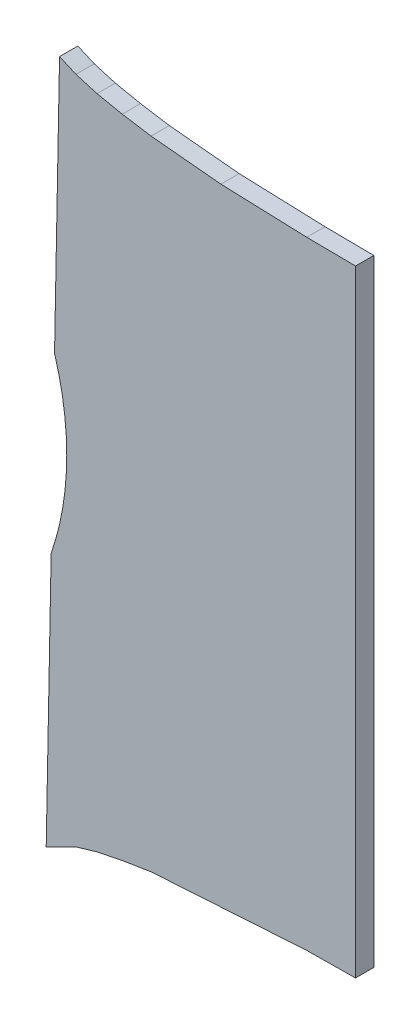
ISO-10303-21;
HEADER;
FILE_DESCRIPTION(('STEP AP214'),'2;1');
FILE_NAME('part.step','',(''),(''),'','','');
FILE_SCHEMA(('AUTOMOTIVE_DESIGN { 1 0 10303 214 1 1 1 1 }'));
ENDSEC;
DATA;
#1=APPLICATION_CONTEXT('core data for automotive mechanical design processes');
#2=APPLICATION_PROTOCOL_DEFINITION('international standard','automotive_design',2000,#1);
#3=PRODUCT_CONTEXT('',#1,'mechanical');
#4=PRODUCT('Part','Part','',(#3));
#5=PRODUCT_RELATED_PRODUCT_CATEGORY('part','',(#4));
#6=PRODUCT_DEFINITION_FORMATION('','',#4);
#7=PRODUCT_DEFINITION_CONTEXT('part definition',#1,'design');
#8=PRODUCT_DEFINITION('design','',#6,#7);
#9=PRODUCT_DEFINITION_SHAPE('','',#8);
#10=(LENGTH_UNIT() NAMED_UNIT(*) SI_UNIT(.MILLI.,.METRE.));
#11=(NAMED_UNIT(*) PLANE_ANGLE_UNIT() SI_UNIT($,.RADIAN.));
#12=(NAMED_UNIT(*) SI_UNIT($,.STERADIAN.) SOLID_ANGLE_UNIT());
#13=UNCERTAINTY_MEASURE_WITH_UNIT(LENGTH_MEASURE(1.E-05),#10,'distance_accuracy_value','');
#14=(GEOMETRIC_REPRESENTATION_CONTEXT(3) GLOBAL_UNCERTAINTY_ASSIGNED_CONTEXT((#13)) GLOBAL_UNIT_ASSIGNED_CONTEXT((#10,
#11,#12)) REPRESENTATION_CONTEXT('',''));
#15=CARTESIAN_POINT('',(0.,0.,0.));
#16=DIRECTION('',(0.,0.,1.));
#17=DIRECTION('',(1.,0.,0.));
#18=AXIS2_PLACEMENT_3D('',#15,#16,#17);
#19=CARTESIAN_POINT('',(80.0120010375977,69.9800033569336,0.));
#20=DIRECTION('',(-1.,0.,0.));
#21=DIRECTION('',(0.,1.,0.));
#22=AXIS2_PLACEMENT_3D('',#19,#20,#21);
#23=PLANE('',#22);
#24=DIRECTION('',(0.,1.,0.));
#25=VECTOR('',#24,1.);
#26=CARTESIAN_POINT('',(80.0120010375977,69.9800033569336,0.03556));
#27=LINE('',#26,#25);
#28=CARTESIAN_POINT('',(80.0120010375977,69.9800033569336,0.03556));
#29=VERTEX_POINT('',#28);
#30=CARTESIAN_POINT('',(80.0120010375977,71.1800003051758,0.03556));
#31=VERTEX_POINT('',#30);
#32=EDGE_CURVE('E11',#29,#31,#27,.T.);
#33=ORIENTED_EDGE('',*,*,#32,.F.);
#34=DIRECTION('',(0.,0.,1.));
#35=VECTOR('',#34,1.);
#36=CARTESIAN_POINT('',(80.0120010375977,69.9800033569336,0.));
#37=LINE('',#36,#35);
#38=CARTESIAN_POINT('',(80.0120010375977,69.9800033569336,0.));
#39=VERTEX_POINT('',#38);
#40=EDGE_CURVE('E24',#39,#29,#37,.T.);
#41=ORIENTED_EDGE('',*,*,#40,.F.);
#42=DIRECTION('',(0.,1.,0.));
#43=VECTOR('',#42,1.);
#44=CARTESIAN_POINT('',(80.0120010375977,69.9800033569336,0.));
#45=LINE('',#44,#43);
#46=CARTESIAN_POINT('',(80.0120010375977,71.1800003051758,0.));
#47=VERTEX_POINT('',#46);
#48=EDGE_CURVE('E281',#39,#47,#45,.T.);
#49=ORIENTED_EDGE('',*,*,#48,.T.);
#50=DIRECTION('',(0.,0.,1.));
#51=VECTOR('',#50,1.);
#52=CARTESIAN_POINT('',(80.0120010375977,71.1800003051758,0.));
#53=LINE('',#52,#51);
#54=EDGE_CURVE('E37',#47,#31,#53,.T.);
#55=ORIENTED_EDGE('',*,*,#54,.T.);
#56=EDGE_LOOP('',(#33,#41,#49,#55));
#57=FACE_BOUND('',#56,.T.);
#58=ADVANCED_FACE('F17',(#57),#23,.F.);
#59=CARTESIAN_POINT('',(79.9169998168945,69.9789962768555,0.));
#60=DIRECTION('',(-0.0106001111368589,0.999943817243692,0.));
#61=DIRECTION('',(0.999943817243692,0.0106001111368589,0.));
#62=AXIS2_PLACEMENT_3D('',#59,#60,#61);
#63=PLANE('',#62);
#64=DIRECTION('',(0.999943817243692,0.0106001111368589,0.));
#65=VECTOR('',#64,1.);
#66=CARTESIAN_POINT('',(79.9169998168945,69.9789962768555,0.03556));
#67=LINE('',#66,#65);
#68=CARTESIAN_POINT('',(79.9169998168945,69.9789962768555,0.03556));
#69=VERTEX_POINT('',#68);
#70=EDGE_CURVE('E277',#69,#29,#67,.T.);
#71=ORIENTED_EDGE('',*,*,#70,.F.);
#72=DIRECTION('',(0.,0.,1.));
#73=VECTOR('',#72,1.);
#74=CARTESIAN_POINT('',(79.9169998168945,69.9789962768555,0.));
#75=LINE('',#74,#73);
#76=CARTESIAN_POINT('',(79.9169998168945,69.9789962768555,0.));
#77=VERTEX_POINT('',#76);
#78=EDGE_CURVE('E275',#77,#69,#75,.T.);
#79=ORIENTED_EDGE('',*,*,#78,.F.);
#80=DIRECTION('',(0.999943817243692,0.0106001111368589,0.));
#81=VECTOR('',#80,1.);
#82=CARTESIAN_POINT('',(79.9169998168945,69.9789962768555,0.));
#83=LINE('',#82,#81);
#84=EDGE_CURVE('E273',#77,#39,#83,.T.);
#85=ORIENTED_EDGE('',*,*,#84,.T.);
#86=ORIENTED_EDGE('',*,*,#40,.T.);
#87=EDGE_LOOP('',(#71,#79,#85,#86));
#88=FACE_BOUND('',#87,.T.);
#89=ADVANCED_FACE('F284',(#88),#63,.F.);
#90=CARTESIAN_POINT('',(79.613998413086,69.9599990844727,0.));
#91=DIRECTION('',(-0.0625738496276475,0.998040336530932,0.));
#92=DIRECTION('',(0.998040336530932,0.0625738496276475,0.));
#93=AXIS2_PLACEMENT_3D('',#90,#91,#92);
#94=PLANE('',#93);
#95=DIRECTION('',(0.998040336530932,0.0625738496276475,0.));
#96=VECTOR('',#95,1.);
#97=CARTESIAN_POINT('',(79.6139984130859,69.9599990844727,0.03556));
#98=LINE('',#97,#96);
#99=CARTESIAN_POINT('',(79.6139984130859,69.9599990844727,0.03556));
#100=VERTEX_POINT('',#99);
#101=EDGE_CURVE('E270',#100,#69,#98,.T.);
#102=ORIENTED_EDGE('',*,*,#101,.F.);
#103=DIRECTION('',(0.,0.,1.));
#104=VECTOR('',#103,1.);
#105=CARTESIAN_POINT('',(79.6139984130859,69.9599990844727,0.));
#106=LINE('',#105,#104);
#107=CARTESIAN_POINT('',(79.6139984130859,69.9599990844727,0.));
#108=VERTEX_POINT('',#107);
#109=EDGE_CURVE('E268',#108,#100,#106,.T.);
#110=ORIENTED_EDGE('',*,*,#109,.F.);
#111=DIRECTION('',(0.998040336530932,0.0625738496276475,0.));
#112=VECTOR('',#111,1.);
#113=CARTESIAN_POINT('',(79.6139984130859,69.9599990844727,0.));
#114=LINE('',#113,#112);
#115=EDGE_CURVE('E265',#108,#77,#114,.T.);
#116=ORIENTED_EDGE('',*,*,#115,.T.);
#117=ORIENTED_EDGE('',*,*,#78,.T.);
#118=EDGE_LOOP('',(#102,#110,#116,#117));
#119=FACE_BOUND('',#118,.T.);
#120=ADVANCED_FACE('F287',(#119),#94,.F.);
#121=CARTESIAN_POINT('',(79.5579986572266,69.9509963989258,0.));
#122=DIRECTION('',(-0.158724925844647,0.987322843813315,0.));
#123=DIRECTION('',(0.987322843813315,0.158724925844647,0.));
#124=AXIS2_PLACEMENT_3D('',#121,#122,#123);
#125=PLANE('',#124);
#126=DIRECTION('',(0.987322843813315,0.158724925844647,0.));
#127=VECTOR('',#126,1.);
#128=CARTESIAN_POINT('',(79.5579986572266,69.9509963989258,0.03556));
#129=LINE('',#128,#127);
#130=CARTESIAN_POINT('',(79.5579986572266,69.9509963989258,0.03556));
#131=VERTEX_POINT('',#130);
#132=EDGE_CURVE('E262',#131,#100,#129,.T.);
#133=ORIENTED_EDGE('',*,*,#132,.F.);
#134=DIRECTION('',(0.,0.,1.));
#135=VECTOR('',#134,1.);
#136=CARTESIAN_POINT('',(79.5579986572266,69.9509963989258,0.));
#137=LINE('',#136,#135);
#138=CARTESIAN_POINT('',(79.5579986572266,69.9509963989258,0.));
#139=VERTEX_POINT('',#138);
#140=EDGE_CURVE('E260',#139,#131,#137,.T.);
#141=ORIENTED_EDGE('',*,*,#140,.F.);
#142=DIRECTION('',(0.987322843813315,0.158724925844647,0.));
#143=VECTOR('',#142,1.);
#144=CARTESIAN_POINT('',(79.5579986572266,69.9509963989258,0.));
#145=LINE('',#144,#143);
#146=EDGE_CURVE('E257',#139,#108,#145,.T.);
#147=ORIENTED_EDGE('',*,*,#146,.T.);
#148=ORIENTED_EDGE('',*,*,#109,.T.);
#149=EDGE_LOOP('',(#133,#141,#147,#148));
#150=FACE_BOUND('',#149,.T.);
#151=ADVANCED_FACE('F292',(#150),#125,.F.);
#152=CARTESIAN_POINT('',(79.5090026855469,69.9410018920898,0.));
#153=DIRECTION('',(-0.199870334238002,0.979822356088893,0.));
#154=DIRECTION('',(0.979822356088893,0.199870334238002,0.));
#155=AXIS2_PLACEMENT_3D('',#152,#153,#154);
#156=PLANE('',#155);
#157=DIRECTION('',(0.979822356088893,0.199870334238002,0.));
#158=VECTOR('',#157,1.);
#159=CARTESIAN_POINT('',(79.5090026855469,69.9410018920898,0.03556));
#160=LINE('',#159,#158);
#161=CARTESIAN_POINT('',(79.5090026855469,69.9410018920898,0.03556));
#162=VERTEX_POINT('',#161);
#163=EDGE_CURVE('E254',#162,#131,#160,.T.);
#164=ORIENTED_EDGE('',*,*,#163,.F.);
#165=DIRECTION('',(0.,0.,1.));
#166=VECTOR('',#165,1.);
#167=CARTESIAN_POINT('',(79.5090026855469,69.9410018920898,0.));
#168=LINE('',#167,#166);
#169=CARTESIAN_POINT('',(79.5090026855469,69.9410018920898,0.));
#170=VERTEX_POINT('',#169);
#171=EDGE_CURVE('E252',#170,#162,#168,.T.);
#172=ORIENTED_EDGE('',*,*,#171,.F.);
#173=DIRECTION('',(0.979822356088893,0.199870334238002,0.));
#174=VECTOR('',#173,1.);
#175=CARTESIAN_POINT('',(79.5090026855469,69.9410018920898,0.));
#176=LINE('',#175,#174);
#177=EDGE_CURVE('E249',#170,#139,#176,.T.);
#178=ORIENTED_EDGE('',*,*,#177,.T.);
#179=ORIENTED_EDGE('',*,*,#140,.T.);
#180=EDGE_LOOP('',(#164,#172,#178,#179));
#181=FACE_BOUND('',#180,.T.);
#182=ADVANCED_FACE('F295',(#181),#156,.F.);
#183=CARTESIAN_POINT('',(79.4680023193359,69.9290008544922,0.));
#184=DIRECTION('',(-0.280918813771343,0.959731535414619,0.));
#185=DIRECTION('',(0.959731535414619,0.280918813771343,0.));
#186=AXIS2_PLACEMENT_3D('',#183,#184,#185);
#187=PLANE('',#186);
#188=DIRECTION('',(0.959731535414619,0.280918813771343,0.));
#189=VECTOR('',#188,1.);
#190=CARTESIAN_POINT('',(79.4680023193359,69.9290008544922,0.03556));
#191=LINE('',#190,#189);
#192=CARTESIAN_POINT('',(79.4680023193359,69.9290008544922,0.03556));
#193=VERTEX_POINT('',#192);
#194=EDGE_CURVE('E246',#193,#162,#191,.T.);
#195=ORIENTED_EDGE('',*,*,#194,.F.);
#196=DIRECTION('',(0.,0.,1.));
#197=VECTOR('',#196,1.);
#198=CARTESIAN_POINT('',(79.4680023193359,69.9290008544922,0.));
#199=LINE('',#198,#197);
#200=CARTESIAN_POINT('',(79.4680023193359,69.9290008544922,0.));
#201=VERTEX_POINT('',#200);
#202=EDGE_CURVE('E244',#201,#193,#199,.T.);
#203=ORIENTED_EDGE('',*,*,#202,.F.);
#204=DIRECTION('',(0.959731535414619,0.280918813771343,0.));
#205=VECTOR('',#204,1.);
#206=CARTESIAN_POINT('',(79.4680023193359,69.9290008544922,0.));
#207=LINE('',#206,#205);
#208=EDGE_CURVE('E241',#201,#170,#207,.T.);
#209=ORIENTED_EDGE('',*,*,#208,.T.);
#210=ORIENTED_EDGE('',*,*,#171,.T.);
#211=EDGE_LOOP('',(#195,#203,#209,#210));
#212=FACE_BOUND('',#211,.T.);
#213=ADVANCED_FACE('F300',(#212),#187,.F.);
#214=CARTESIAN_POINT('',(79.4100036621094,69.9000015258789,0.));
#215=DIRECTION('',(-0.447213595499958,0.894427190999916,0.));
#216=DIRECTION('',(0.894427190999916,0.447213595499958,0.));
#217=AXIS2_PLACEMENT_3D('',#214,#215,#216);
#218=PLANE('',#217);
#219=DIRECTION('',(0.894427190999916,0.447213595499958,0.));
#220=VECTOR('',#219,1.);
#221=CARTESIAN_POINT('',(79.4100036621094,69.9000015258789,0.03556));
#222=LINE('',#221,#220);
#223=CARTESIAN_POINT('',(79.4100036621094,69.9000015258789,0.03556));
#224=VERTEX_POINT('',#223);
#225=EDGE_CURVE('E238',#224,#193,#222,.T.);
#226=ORIENTED_EDGE('',*,*,#225,.F.);
#227=DIRECTION('',(0.,0.,1.));
#228=VECTOR('',#227,1.);
#229=CARTESIAN_POINT('',(79.4100036621094,69.9000015258789,0.));
#230=LINE('',#229,#228);
#231=CARTESIAN_POINT('',(79.4100036621094,69.9000015258789,0.));
#232=VERTEX_POINT('',#231);
#233=EDGE_CURVE('E236',#232,#224,#230,.T.);
#234=ORIENTED_EDGE('',*,*,#233,.F.);
#235=DIRECTION('',(0.894427190999916,0.447213595499958,0.));
#236=VECTOR('',#235,1.);
#237=CARTESIAN_POINT('',(79.4100036621094,69.9000015258789,0.));
#238=LINE('',#237,#236);
#239=EDGE_CURVE('E233',#232,#201,#238,.T.);
#240=ORIENTED_EDGE('',*,*,#239,.T.);
#241=ORIENTED_EDGE('',*,*,#202,.T.);
#242=EDGE_LOOP('',(#226,#234,#240,#241));
#243=FACE_BOUND('',#242,.T.);
#244=ADVANCED_FACE('F303',(#243),#218,.F.);
#245=CARTESIAN_POINT('',(79.4196637730177,70.3998548491112,0.));
#246=DIRECTION('',(0.999813307260202,-0.019322283131597,0.));
#247=DIRECTION('',(-0.019322283131597,-0.999813307260202,0.));
#248=AXIS2_PLACEMENT_3D('',#245,#246,#247);
#249=PLANE('',#248);
#250=DIRECTION('',(-0.019322283131597,-0.999813307260202,0.));
#251=VECTOR('',#250,1.);
#252=CARTESIAN_POINT('',(79.4359970092773,71.245002746582,0.03556));
#253=LINE('',#252,#251);
#254=CARTESIAN_POINT('',(79.4196637730177,70.3998548491112,0.03556));
#255=VERTEX_POINT('',#254);
#256=EDGE_CURVE('E230',#255,#224,#253,.T.);
#257=ORIENTED_EDGE('',*,*,#256,.F.);
#258=DIRECTION('',(0.,0.,1.));
#259=VECTOR('',#258,1.);
#260=CARTESIAN_POINT('',(79.4196637730177,70.3998548491112,0.));
#261=LINE('',#260,#259);
#262=CARTESIAN_POINT('',(79.4196637730177,70.3998548491112,0.));
#263=VERTEX_POINT('',#262);
#264=EDGE_CURVE('E228',#263,#255,#261,.T.);
#265=ORIENTED_EDGE('',*,*,#264,.F.);
#266=DIRECTION('',(-0.019322283131597,-0.999813307260202,0.));
#267=VECTOR('',#266,1.);
#268=CARTESIAN_POINT('',(79.4359970092773,71.245002746582,0.));
#269=LINE('',#268,#267);
#270=EDGE_CURVE('E225',#263,#232,#269,.T.);
#271=ORIENTED_EDGE('',*,*,#270,.T.);
#272=ORIENTED_EDGE('',*,*,#233,.T.);
#273=EDGE_LOOP('',(#257,#265,#271,#272));
#274=FACE_BOUND('',#273,.T.);
#275=ADVANCED_FACE('F308',(#274),#249,.F.);
#276=CARTESIAN_POINT('',(78.90002,70.5800468,0.));
#277=DIRECTION('',(0.,0.,-1.));
#278=DIRECTION('',(1.,0.,0.));
#279=AXIS2_PLACEMENT_3D('',#276,#277,#278);
#280=CYLINDRICAL_SURFACE('',#279,0.5499989);
#281=ORIENTED_EDGE('',*,*,#264,.T.);
#282=CARTESIAN_POINT('',(78.90002,70.5800468,0.03556));
#283=DIRECTION('',(0.,0.,1.));
#284=DIRECTION('',(1.,0.,0.));
#285=AXIS2_PLACEMENT_3D('',#282,#283,#284);
#286=CIRCLE('',#285,0.5499989);
#287=CARTESIAN_POINT('',(79.4500189,70.5800468,0.03556));
#288=VERTEX_POINT('',#287);
#289=EDGE_CURVE('E222',#255,#288,#286,.T.);
#290=ORIENTED_EDGE('',*,*,#289,.T.);
#291=DIRECTION('',(0.,0.,1.));
#292=VECTOR('',#291,1.);
#293=CARTESIAN_POINT('',(79.4500189,70.5800468,0.));
#294=LINE('',#293,#292);
#295=CARTESIAN_POINT('',(79.4500189,70.5800468,0.));
#296=VERTEX_POINT('',#295);
#297=EDGE_CURVE('E220',#296,#288,#294,.T.);
#298=ORIENTED_EDGE('',*,*,#297,.F.);
#299=CARTESIAN_POINT('',(78.90002,70.5800468,0.));
#300=DIRECTION('',(0.,0.,1.));
#301=DIRECTION('',(1.,0.,0.));
#302=AXIS2_PLACEMENT_3D('',#299,#300,#301);
#303=CIRCLE('',#302,0.5499989);
#304=EDGE_CURVE('E217',#263,#296,#303,.T.);
#305=ORIENTED_EDGE('',*,*,#304,.F.);
#306=EDGE_LOOP('',(#281,#290,#298,#305));
#307=FACE_BOUND('',#306,.T.);
#308=ADVANCED_FACE('F311',(#307),#280,.F.);
#309=CARTESIAN_POINT('',(78.90002,70.5800468,0.));
#310=DIRECTION('',(0.,0.,-1.));
#311=DIRECTION('',(1.,0.,0.));
#312=AXIS2_PLACEMENT_3D('',#309,#310,#311);
#313=CYLINDRICAL_SURFACE('',#312,0.5499989);
#314=ORIENTED_EDGE('',*,*,#297,.T.);
#315=CARTESIAN_POINT('',(78.90002,70.5800468,0.03556));
#316=DIRECTION('',(0.,0.,1.));
#317=DIRECTION('',(1.,0.,0.));
#318=AXIS2_PLACEMENT_3D('',#315,#316,#317);
#319=CIRCLE('',#318,0.5499989);
#320=CARTESIAN_POINT('',(79.426237894125,70.7400265421672,0.03556));
#321=VERTEX_POINT('',#320);
#322=EDGE_CURVE('E214',#288,#321,#319,.T.);
#323=ORIENTED_EDGE('',*,*,#322,.T.);
#324=DIRECTION('',(0.,0.,1.));
#325=VECTOR('',#324,1.);
#326=CARTESIAN_POINT('',(79.426237894125,70.7400265421672,0.));
#327=LINE('',#326,#325);
#328=CARTESIAN_POINT('',(79.426237894125,70.7400265421672,0.));
#329=VERTEX_POINT('',#328);
#330=EDGE_CURVE('E212',#329,#321,#327,.T.);
#331=ORIENTED_EDGE('',*,*,#330,.F.);
#332=EDGE_CURVE('E211',#296,#329,#303,.T.);
#333=ORIENTED_EDGE('',*,*,#332,.F.);
#334=EDGE_LOOP('',(#314,#323,#331,#333));
#335=FACE_BOUND('',#334,.T.);
#336=ADVANCED_FACE('F318',(#335),#313,.F.);
#337=CARTESIAN_POINT('',(79.4359970092774,71.245002746582,0.));
#338=DIRECTION('',(0.999813307260202,-0.019322283131597,0.));
#339=DIRECTION('',(-0.019322283131597,-0.999813307260202,0.));
#340=AXIS2_PLACEMENT_3D('',#337,#338,#339);
#341=PLANE('',#340);
#342=DIRECTION('',(-0.019322283131597,-0.999813307260202,0.));
#343=VECTOR('',#342,1.);
#344=CARTESIAN_POINT('',(79.4359970092773,71.245002746582,0.03556));
#345=LINE('',#344,#343);
#346=CARTESIAN_POINT('',(79.4359970092773,71.245002746582,0.03556));
#347=VERTEX_POINT('',#346);
#348=EDGE_CURVE('E208',#347,#321,#345,.T.);
#349=ORIENTED_EDGE('',*,*,#348,.F.);
#350=DIRECTION('',(0.,0.,1.));
#351=VECTOR('',#350,1.);
#352=CARTESIAN_POINT('',(79.4359970092773,71.245002746582,0.));
#353=LINE('',#352,#351);
#354=CARTESIAN_POINT('',(79.4359970092773,71.245002746582,0.));
#355=VERTEX_POINT('',#354);
#356=EDGE_CURVE('E206',#355,#347,#353,.T.);
#357=ORIENTED_EDGE('',*,*,#356,.F.);
#358=EDGE_CURVE('E205',#355,#329,#269,.T.);
#359=ORIENTED_EDGE('',*,*,#358,.T.);
#360=ORIENTED_EDGE('',*,*,#330,.T.);
#361=EDGE_LOOP('',(#349,#357,#359,#360));
#362=FACE_BOUND('',#361,.T.);
#363=ADVANCED_FACE('F321',(#362),#341,.F.);
#364=CARTESIAN_POINT('',(79.4680023193359,71.2310028076172,0.));
#365=DIRECTION('',(-0.400761548340712,-0.916182395253017,0.));
#366=DIRECTION('',(-0.916182395253017,0.400761548340712,0.));
#367=AXIS2_PLACEMENT_3D('',#364,#365,#366);
#368=PLANE('',#367);
#369=DIRECTION('',(-0.916182395253017,0.400761548340712,0.));
#370=VECTOR('',#369,1.);
#371=CARTESIAN_POINT('',(79.4680023193359,71.2310028076172,0.03556));
#372=LINE('',#371,#370);
#373=CARTESIAN_POINT('',(79.4680023193359,71.2310028076172,0.03556));
#374=VERTEX_POINT('',#373);
#375=EDGE_CURVE('E202',#374,#347,#372,.T.);
#376=ORIENTED_EDGE('',*,*,#375,.F.);
#377=DIRECTION('',(0.,0.,1.));
#378=VECTOR('',#377,1.);
#379=CARTESIAN_POINT('',(79.4680023193359,71.2310028076172,0.));
#380=LINE('',#379,#378);
#381=CARTESIAN_POINT('',(79.4680023193359,71.2310028076172,0.));
#382=VERTEX_POINT('',#381);
#383=EDGE_CURVE('E200',#382,#374,#380,.T.);
#384=ORIENTED_EDGE('',*,*,#383,.F.);
#385=DIRECTION('',(-0.916182395253017,0.400761548340712,0.));
#386=VECTOR('',#385,1.);
#387=CARTESIAN_POINT('',(79.4680023193359,71.2310028076172,0.));
#388=LINE('',#387,#386);
#389=EDGE_CURVE('E197',#382,#355,#388,.T.);
#390=ORIENTED_EDGE('',*,*,#389,.T.);
#391=ORIENTED_EDGE('',*,*,#356,.T.);
#392=EDGE_LOOP('',(#376,#384,#390,#391));
#393=FACE_BOUND('',#392,.T.);
#394=ADVANCED_FACE('F326',(#393),#368,.F.);
#395=CARTESIAN_POINT('',(79.5090026855469,71.2190017700195,0.));
#396=DIRECTION('',(-0.280918813771343,-0.959731535414619,0.));
#397=DIRECTION('',(-0.959731535414619,0.280918813771343,0.));
#398=AXIS2_PLACEMENT_3D('',#395,#396,#397);
#399=PLANE('',#398);
#400=DIRECTION('',(-0.959731535414619,0.280918813771343,0.));
#401=VECTOR('',#400,1.);
#402=CARTESIAN_POINT('',(79.5090026855469,71.2190017700195,0.03556));
#403=LINE('',#402,#401);
#404=CARTESIAN_POINT('',(79.5090026855469,71.2190017700195,0.03556));
#405=VERTEX_POINT('',#404);
#406=EDGE_CURVE('E194',#405,#374,#403,.T.);
#407=ORIENTED_EDGE('',*,*,#406,.F.);
#408=DIRECTION('',(0.,0.,1.));
#409=VECTOR('',#408,1.);
#410=CARTESIAN_POINT('',(79.5090026855469,71.2190017700195,0.));
#411=LINE('',#410,#409);
#412=CARTESIAN_POINT('',(79.5090026855469,71.2190017700195,0.));
#413=VERTEX_POINT('',#412);
#414=EDGE_CURVE('E192',#413,#405,#411,.T.);
#415=ORIENTED_EDGE('',*,*,#414,.F.);
#416=DIRECTION('',(-0.959731535414619,0.280918813771343,0.));
#417=VECTOR('',#416,1.);
#418=CARTESIAN_POINT('',(79.5090026855469,71.2190017700195,0.));
#419=LINE('',#418,#417);
#420=EDGE_CURVE('E189',#413,#382,#419,.T.);
#421=ORIENTED_EDGE('',*,*,#420,.T.);
#422=ORIENTED_EDGE('',*,*,#383,.T.);
#423=EDGE_LOOP('',(#407,#415,#421,#422));
#424=FACE_BOUND('',#423,.T.);
#425=ADVANCED_FACE('F329',(#424),#399,.F.);
#426=CARTESIAN_POINT('',(79.5579986572266,71.2089996337891,0.));
#427=DIRECTION('',(-0.200016805310508,-0.979792466593502,0.));
#428=DIRECTION('',(-0.979792466593502,0.200016805310508,0.));
#429=AXIS2_PLACEMENT_3D('',#426,#427,#428);
#430=PLANE('',#429);
#431=DIRECTION('',(-0.979792466593502,0.200016805310508,0.));
#432=VECTOR('',#431,1.);
#433=CARTESIAN_POINT('',(79.5579986572266,71.2089996337891,0.03556));
#434=LINE('',#433,#432);
#435=CARTESIAN_POINT('',(79.5579986572266,71.2089996337891,0.03556));
#436=VERTEX_POINT('',#435);
#437=EDGE_CURVE('E186',#436,#405,#434,.T.);
#438=ORIENTED_EDGE('',*,*,#437,.F.);
#439=DIRECTION('',(0.,0.,1.));
#440=VECTOR('',#439,1.);
#441=CARTESIAN_POINT('',(79.5579986572266,71.2089996337891,0.));
#442=LINE('',#441,#440);
#443=CARTESIAN_POINT('',(79.5579986572266,71.2089996337891,0.));
#444=VERTEX_POINT('',#443);
#445=EDGE_CURVE('E184',#444,#436,#442,.T.);
#446=ORIENTED_EDGE('',*,*,#445,.F.);
#447=DIRECTION('',(-0.979792466593502,0.200016805310508,0.));
#448=VECTOR('',#447,1.);
#449=CARTESIAN_POINT('',(79.5579986572266,71.2089996337891,0.));
#450=LINE('',#449,#448);
#451=EDGE_CURVE('E181',#444,#413,#450,.T.);
#452=ORIENTED_EDGE('',*,*,#451,.T.);
#453=ORIENTED_EDGE('',*,*,#414,.T.);
#454=EDGE_LOOP('',(#438,#446,#452,#453));
#455=FACE_BOUND('',#454,.T.);
#456=ADVANCED_FACE('F333',(#455),#430,.F.);
#457=CARTESIAN_POINT('',(79.613998413086,71.1999969482422,0.));
#458=DIRECTION('',(-0.158724925844647,-0.987322843813315,0.));
#459=DIRECTION('',(-0.987322843813315,0.158724925844647,0.));
#460=AXIS2_PLACEMENT_3D('',#457,#458,#459);
#461=PLANE('',#460);
#462=DIRECTION('',(-0.987322843813315,0.158724925844647,0.));
#463=VECTOR('',#462,1.);
#464=CARTESIAN_POINT('',(79.6139984130859,71.1999969482422,0.03556));
#465=LINE('',#464,#463);
#466=CARTESIAN_POINT('',(79.6139984130859,71.1999969482422,0.03556));
#467=VERTEX_POINT('',#466);
#468=EDGE_CURVE('E178',#467,#436,#465,.T.);
#469=ORIENTED_EDGE('',*,*,#468,.F.);
#470=DIRECTION('',(0.,0.,1.));
#471=VECTOR('',#470,1.);
#472=CARTESIAN_POINT('',(79.6139984130859,71.1999969482422,0.));
#473=LINE('',#472,#471);
#474=CARTESIAN_POINT('',(79.6139984130859,71.1999969482422,0.));
#475=VERTEX_POINT('',#474);
#476=EDGE_CURVE('E176',#475,#467,#473,.T.);
#477=ORIENTED_EDGE('',*,*,#476,.F.);
#478=DIRECTION('',(-0.987322843813315,0.158724925844647,0.));
#479=VECTOR('',#478,1.);
#480=CARTESIAN_POINT('',(79.6139984130859,71.1999969482422,0.));
#481=LINE('',#480,#479);
#482=EDGE_CURVE('E173',#475,#444,#481,.T.);
#483=ORIENTED_EDGE('',*,*,#482,.T.);
#484=ORIENTED_EDGE('',*,*,#445,.T.);
#485=EDGE_LOOP('',(#469,#477,#483,#484));
#486=FACE_BOUND('',#485,.T.);
#487=ADVANCED_FACE('F336',(#486),#461,.F.);
#488=CARTESIAN_POINT('',(79.75,71.1869964599609,0.));
#489=DIRECTION('',(-0.0951569465430121,-0.99546228232144,0.));
#490=DIRECTION('',(-0.99546228232144,0.0951569465430121,0.));
#491=AXIS2_PLACEMENT_3D('',#488,#489,#490);
#492=PLANE('',#491);
#493=DIRECTION('',(-0.99546228232144,0.0951569465430121,0.));
#494=VECTOR('',#493,1.);
#495=CARTESIAN_POINT('',(79.75,71.1869964599609,0.03556));
#496=LINE('',#495,#494);
#497=CARTESIAN_POINT('',(79.75,71.1869964599609,0.03556));
#498=VERTEX_POINT('',#497);
#499=EDGE_CURVE('E170',#498,#467,#496,.T.);
#500=ORIENTED_EDGE('',*,*,#499,.F.);
#501=DIRECTION('',(0.,0.,1.));
#502=VECTOR('',#501,1.);
#503=CARTESIAN_POINT('',(79.75,71.1869964599609,0.));
#504=LINE('',#503,#502);
#505=CARTESIAN_POINT('',(79.75,71.1869964599609,0.));
#506=VERTEX_POINT('',#505);
#507=EDGE_CURVE('E168',#506,#498,#504,.T.);
#508=ORIENTED_EDGE('',*,*,#507,.F.);
#509=DIRECTION('',(-0.99546228232144,0.0951569465430121,0.));
#510=VECTOR('',#509,1.);
#511=CARTESIAN_POINT('',(79.75,71.1869964599609,0.));
#512=LINE('',#511,#510);
#513=EDGE_CURVE('E159',#506,#475,#512,.T.);
#514=ORIENTED_EDGE('',*,*,#513,.T.);
#515=ORIENTED_EDGE('',*,*,#476,.T.);
#516=EDGE_LOOP('',(#500,#508,#514,#515));
#517=FACE_BOUND('',#516,.T.);
#518=ADVANCED_FACE('F339',(#517),#492,.F.);
#519=CARTESIAN_POINT('',(79.9169998168945,71.1809997558594,0.));
#520=DIRECTION('',(-0.0358853190556377,-0.999355914515082,0.));
#521=DIRECTION('',(-0.999355914515082,0.0358853190556377,0.));
#522=AXIS2_PLACEMENT_3D('',#519,#520,#521);
#523=PLANE('',#522);
#524=DIRECTION('',(-0.999355914515082,0.0358853190556377,0.));
#525=VECTOR('',#524,1.);
#526=CARTESIAN_POINT('',(79.9169998168945,71.1809997558594,0.03556));
#527=LINE('',#526,#525);
#528=CARTESIAN_POINT('',(79.9169998168945,71.1809997558594,0.03556));
#529=VERTEX_POINT('',#528);
#530=EDGE_CURVE('E145',#529,#498,#527,.T.);
#531=ORIENTED_EDGE('',*,*,#530,.F.);
#532=DIRECTION('',(0.,0.,1.));
#533=VECTOR('',#532,1.);
#534=CARTESIAN_POINT('',(79.9169998168945,71.1809997558594,0.));
#535=LINE('',#534,#533);
#536=CARTESIAN_POINT('',(79.9169998168945,71.1809997558594,0.));
#537=VERTEX_POINT('',#536);
#538=EDGE_CURVE('E140',#537,#529,#535,.T.);
#539=ORIENTED_EDGE('',*,*,#538,.F.);
#540=DIRECTION('',(-0.999355914515082,0.0358853190556377,0.));
#541=VECTOR('',#540,1.);
#542=CARTESIAN_POINT('',(79.9169998168945,71.1809997558594,0.));
#543=LINE('',#542,#541);
#544=EDGE_CURVE('E143',#537,#506,#543,.T.);
#545=ORIENTED_EDGE('',*,*,#544,.T.);
#546=ORIENTED_EDGE('',*,*,#507,.T.);
#547=EDGE_LOOP('',(#531,#539,#545,#546));
#548=FACE_BOUND('',#547,.T.);
#549=ADVANCED_FACE('F142',(#548),#523,.F.);
#550=CARTESIAN_POINT('',(80.0120010375977,71.1800003051758,0.));
#551=DIRECTION('',(-0.010519816185477,-0.999944665202742,0.));
#552=DIRECTION('',(-0.999944665202742,0.010519816185477,0.));
#553=AXIS2_PLACEMENT_3D('',#550,#551,#552);
#554=PLANE('',#553);
#555=DIRECTION('',(-0.999944665202742,0.010519816185477,0.));
#556=VECTOR('',#555,1.);
#557=CARTESIAN_POINT('',(80.0120010375977,71.1800003051758,0.03556));
#558=LINE('',#557,#556);
#559=EDGE_CURVE('E160',#31,#529,#558,.T.);
#560=ORIENTED_EDGE('',*,*,#559,.F.);
#561=ORIENTED_EDGE('',*,*,#54,.F.);
#562=DIRECTION('',(-0.999944665202742,0.010519816185477,0.));
#563=VECTOR('',#562,1.);
#564=CARTESIAN_POINT('',(80.0120010375977,71.1800003051758,0.));
#565=LINE('',#564,#563);
#566=EDGE_CURVE('E156',#47,#537,#565,.T.);
#567=ORIENTED_EDGE('',*,*,#566,.T.);
#568=ORIENTED_EDGE('',*,*,#538,.T.);
#569=EDGE_LOOP('',(#560,#561,#567,#568));
#570=FACE_BOUND('',#569,.T.);
#571=ADVANCED_FACE('F162',(#570),#554,.F.);
#572=CARTESIAN_POINT('',(80.0120010375977,71.1800003051758,0.));
#573=DIRECTION('',(0.,0.,1.));
#574=DIRECTION('',(1.,0.,0.));
#575=AXIS2_PLACEMENT_3D('',#572,#573,#574);
#576=PLANE('',#575);
#577=ORIENTED_EDGE('',*,*,#566,.F.);
#578=ORIENTED_EDGE('',*,*,#48,.F.);
#579=ORIENTED_EDGE('',*,*,#84,.F.);
#580=ORIENTED_EDGE('',*,*,#115,.F.);
#581=ORIENTED_EDGE('',*,*,#146,.F.);
#582=ORIENTED_EDGE('',*,*,#177,.F.);
#583=ORIENTED_EDGE('',*,*,#208,.F.);
#584=ORIENTED_EDGE('',*,*,#239,.F.);
#585=ORIENTED_EDGE('',*,*,#270,.F.);
#586=ORIENTED_EDGE('',*,*,#304,.T.);
#587=ORIENTED_EDGE('',*,*,#332,.T.);
#588=ORIENTED_EDGE('',*,*,#358,.F.);
#589=ORIENTED_EDGE('',*,*,#389,.F.);
#590=ORIENTED_EDGE('',*,*,#420,.F.);
#591=ORIENTED_EDGE('',*,*,#451,.F.);
#592=ORIENTED_EDGE('',*,*,#482,.F.);
#593=ORIENTED_EDGE('',*,*,#513,.F.);
#594=ORIENTED_EDGE('',*,*,#544,.F.);
#595=EDGE_LOOP('',(#577,#578,#579,#580,#581,#582,#583,#584,#585,#586,#587,#588,#589,#590,#591,
#592,#593,#594));
#596=FACE_BOUND('',#595,.T.);
#597=ADVANCED_FACE('F154',(#596),#576,.F.);
#598=CARTESIAN_POINT('',(80.0120010375977,71.1800003051758,0.03556));
#599=DIRECTION('',(0.,0.,1.));
#600=DIRECTION('',(1.,0.,0.));
#601=AXIS2_PLACEMENT_3D('',#598,#599,#600);
#602=PLANE('',#601);
#603=ORIENTED_EDGE('',*,*,#32,.T.);
#604=ORIENTED_EDGE('',*,*,#559,.T.);
#605=ORIENTED_EDGE('',*,*,#530,.T.);
#606=ORIENTED_EDGE('',*,*,#499,.T.);
#607=ORIENTED_EDGE('',*,*,#468,.T.);
#608=ORIENTED_EDGE('',*,*,#437,.T.);
#609=ORIENTED_EDGE('',*,*,#406,.T.);
#610=ORIENTED_EDGE('',*,*,#375,.T.);
#611=ORIENTED_EDGE('',*,*,#348,.T.);
#612=ORIENTED_EDGE('',*,*,#322,.F.);
#613=ORIENTED_EDGE('',*,*,#289,.F.);
#614=ORIENTED_EDGE('',*,*,#256,.T.);
#615=ORIENTED_EDGE('',*,*,#225,.T.);
#616=ORIENTED_EDGE('',*,*,#194,.T.);
#617=ORIENTED_EDGE('',*,*,#163,.T.);
#618=ORIENTED_EDGE('',*,*,#132,.T.);
#619=ORIENTED_EDGE('',*,*,#101,.T.);
#620=ORIENTED_EDGE('',*,*,#70,.T.);
#621=EDGE_LOOP('',(#603,#604,#605,#606,#607,#608,#609,#610,#611,#612,#613,#614,#615,#616,#617,
#618,#619,#620));
#622=FACE_BOUND('',#621,.T.);
#623=ADVANCED_FACE('F341',(#622),#602,.T.);
#624=CLOSED_SHELL('',(#58,#89,#120,#151,#182,#213,#244,#275,#308,#336,#363,#394,#425,#456,#487,
#518,#549,#571,#597,#623));
#625=MANIFOLD_SOLID_BREP('B1',#624);
#626=ADVANCED_BREP_SHAPE_REPRESENTATION('',(#18,#625),#14);
#627=SHAPE_DEFINITION_REPRESENTATION(#9,#626);
ENDSEC;
END-ISO-10303-21;
